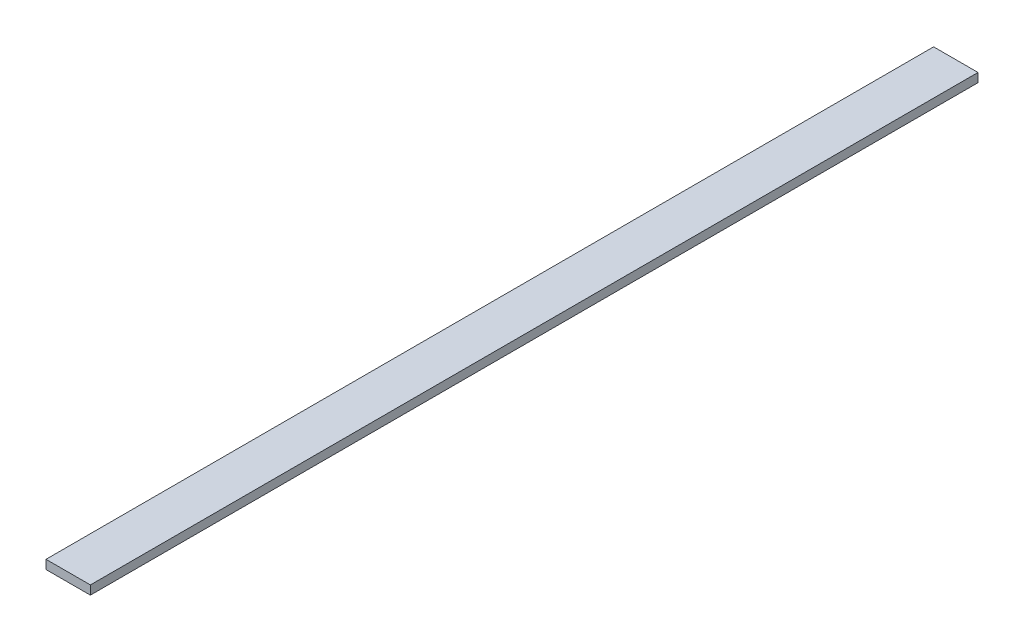
ISO-10303-21;
HEADER;
FILE_DESCRIPTION(('STEP AP214'),'2;1');
FILE_NAME('part.step','',(''),(''),'','','');
FILE_SCHEMA(('AUTOMOTIVE_DESIGN { 1 0 10303 214 1 1 1 1 }'));
ENDSEC;
DATA;
#1=APPLICATION_CONTEXT('core data for automotive mechanical design processes');
#2=APPLICATION_PROTOCOL_DEFINITION('international standard','automotive_design',2000,#1);
#3=PRODUCT_CONTEXT('',#1,'mechanical');
#4=PRODUCT('Part','Part','',(#3));
#5=PRODUCT_RELATED_PRODUCT_CATEGORY('part','',(#4));
#6=PRODUCT_DEFINITION_FORMATION('','',#4);
#7=PRODUCT_DEFINITION_CONTEXT('part definition',#1,'design');
#8=PRODUCT_DEFINITION('design','',#6,#7);
#9=PRODUCT_DEFINITION_SHAPE('','',#8);
#10=(LENGTH_UNIT() NAMED_UNIT(*) SI_UNIT(.MILLI.,.METRE.));
#11=(NAMED_UNIT(*) PLANE_ANGLE_UNIT() SI_UNIT($,.RADIAN.));
#12=(NAMED_UNIT(*) SI_UNIT($,.STERADIAN.) SOLID_ANGLE_UNIT());
#13=UNCERTAINTY_MEASURE_WITH_UNIT(LENGTH_MEASURE(1.E-05),#10,'distance_accuracy_value','');
#14=(GEOMETRIC_REPRESENTATION_CONTEXT(3) GLOBAL_UNCERTAINTY_ASSIGNED_CONTEXT((#13)) GLOBAL_UNIT_ASSIGNED_CONTEXT((#10,
#11,#12)) REPRESENTATION_CONTEXT('',''));
#15=CARTESIAN_POINT('',(0.,0.,0.));
#16=DIRECTION('',(0.,0.,1.));
#17=DIRECTION('',(1.,0.,0.));
#18=AXIS2_PLACEMENT_3D('',#15,#16,#17);
#19=CARTESIAN_POINT('',(0.,2.,0.));
#20=DIRECTION('',(1.,0.,0.));
#21=DIRECTION('',(0.,0.,-1.));
#22=AXIS2_PLACEMENT_3D('',#19,#20,#21);
#23=PLANE('',#22);
#24=DIRECTION('',(0.,0.,1.));
#25=VECTOR('',#24,1.);
#26=CARTESIAN_POINT('',(0.,0.,0.));
#27=LINE('',#26,#25);
#28=CARTESIAN_POINT('',(0.,0.,-200.));
#29=VERTEX_POINT('',#28);
#30=CARTESIAN_POINT('',(0.,0.,0.));
#31=VERTEX_POINT('',#30);
#32=EDGE_CURVE('E107',#29,#31,#27,.T.);
#33=ORIENTED_EDGE('',*,*,#32,.T.);
#34=DIRECTION('',(0.,-1.,0.));
#35=VECTOR('',#34,1.);
#36=CARTESIAN_POINT('',(0.,2.,0.));
#37=LINE('',#36,#35);
#38=CARTESIAN_POINT('',(0.,2.,0.));
#39=VERTEX_POINT('',#38);
#40=EDGE_CURVE('E11',#39,#31,#37,.T.);
#41=ORIENTED_EDGE('',*,*,#40,.F.);
#42=DIRECTION('',(0.,0.,1.));
#43=VECTOR('',#42,1.);
#44=CARTESIAN_POINT('',(0.,2.,0.));
#45=LINE('',#44,#43);
#46=CARTESIAN_POINT('',(0.,2.,-200.));
#47=VERTEX_POINT('',#46);
#48=EDGE_CURVE('E91',#47,#39,#45,.T.);
#49=ORIENTED_EDGE('',*,*,#48,.F.);
#50=DIRECTION('',(0.,-1.,0.));
#51=VECTOR('',#50,1.);
#52=CARTESIAN_POINT('',(0.,2.,-200.));
#53=LINE('',#52,#51);
#54=EDGE_CURVE('E103',#47,#29,#53,.T.);
#55=ORIENTED_EDGE('',*,*,#54,.T.);
#56=EDGE_LOOP('',(#33,#41,#49,#55));
#57=FACE_BOUND('',#56,.T.);
#58=ADVANCED_FACE('F39',(#57),#23,.F.);
#59=CARTESIAN_POINT('',(0.,2.,0.));
#60=DIRECTION('',(0.,0.,-1.));
#61=DIRECTION('',(-1.,0.,0.));
#62=AXIS2_PLACEMENT_3D('',#59,#60,#61);
#63=PLANE('',#62);
#64=DIRECTION('',(1.,0.,0.));
#65=VECTOR('',#64,1.);
#66=CARTESIAN_POINT('',(0.,0.,0.));
#67=LINE('',#66,#65);
#68=CARTESIAN_POINT('',(10.,0.,0.));
#69=VERTEX_POINT('',#68);
#70=EDGE_CURVE('E96',#31,#69,#67,.T.);
#71=ORIENTED_EDGE('',*,*,#70,.T.);
#72=DIRECTION('',(0.,-1.,0.));
#73=VECTOR('',#72,1.);
#74=CARTESIAN_POINT('',(10.,2.,0.));
#75=LINE('',#74,#73);
#76=CARTESIAN_POINT('',(10.,2.,0.));
#77=VERTEX_POINT('',#76);
#78=EDGE_CURVE('E48',#77,#69,#75,.T.);
#79=ORIENTED_EDGE('',*,*,#78,.F.);
#80=DIRECTION('',(1.,0.,0.));
#81=VECTOR('',#80,1.);
#82=CARTESIAN_POINT('',(0.,2.,0.));
#83=LINE('',#82,#81);
#84=EDGE_CURVE('E86',#39,#77,#83,.T.);
#85=ORIENTED_EDGE('',*,*,#84,.F.);
#86=ORIENTED_EDGE('',*,*,#40,.T.);
#87=EDGE_LOOP('',(#71,#79,#85,#86));
#88=FACE_BOUND('',#87,.T.);
#89=ADVANCED_FACE('F95',(#88),#63,.F.);
#90=CARTESIAN_POINT('',(10.,2.,0.));
#91=DIRECTION('',(-1.,0.,0.));
#92=DIRECTION('',(0.,0.,1.));
#93=AXIS2_PLACEMENT_3D('',#90,#91,#92);
#94=PLANE('',#93);
#95=DIRECTION('',(0.,0.,-1.));
#96=VECTOR('',#95,1.);
#97=CARTESIAN_POINT('',(10.,0.,0.));
#98=LINE('',#97,#96);
#99=CARTESIAN_POINT('',(10.,0.,-200.));
#100=VERTEX_POINT('',#99);
#101=EDGE_CURVE('E73',#69,#100,#98,.T.);
#102=ORIENTED_EDGE('',*,*,#101,.T.);
#103=DIRECTION('',(0.,-1.,0.));
#104=VECTOR('',#103,1.);
#105=CARTESIAN_POINT('',(10.,2.,-200.));
#106=LINE('',#105,#104);
#107=CARTESIAN_POINT('',(10.,2.,-200.));
#108=VERTEX_POINT('',#107);
#109=EDGE_CURVE('E98',#108,#100,#106,.T.);
#110=ORIENTED_EDGE('',*,*,#109,.F.);
#111=DIRECTION('',(0.,0.,-1.));
#112=VECTOR('',#111,1.);
#113=CARTESIAN_POINT('',(10.,2.,0.));
#114=LINE('',#113,#112);
#115=EDGE_CURVE('E89',#77,#108,#114,.T.);
#116=ORIENTED_EDGE('',*,*,#115,.F.);
#117=ORIENTED_EDGE('',*,*,#78,.T.);
#118=EDGE_LOOP('',(#102,#110,#116,#117));
#119=FACE_BOUND('',#118,.T.);
#120=ADVANCED_FACE('F99',(#119),#94,.F.);
#121=CARTESIAN_POINT('',(0.,2.,-200.));
#122=DIRECTION('',(0.,0.,1.));
#123=DIRECTION('',(1.,0.,0.));
#124=AXIS2_PLACEMENT_3D('',#121,#122,#123);
#125=PLANE('',#124);
#126=DIRECTION('',(-1.,0.,0.));
#127=VECTOR('',#126,1.);
#128=CARTESIAN_POINT('',(0.,0.,-200.));
#129=LINE('',#128,#127);
#130=EDGE_CURVE('E79',#100,#29,#129,.T.);
#131=ORIENTED_EDGE('',*,*,#130,.T.);
#132=ORIENTED_EDGE('',*,*,#54,.F.);
#133=DIRECTION('',(-1.,0.,0.));
#134=VECTOR('',#133,1.);
#135=CARTESIAN_POINT('',(0.,2.,-200.));
#136=LINE('',#135,#134);
#137=EDGE_CURVE('E56',#108,#47,#136,.T.);
#138=ORIENTED_EDGE('',*,*,#137,.F.);
#139=ORIENTED_EDGE('',*,*,#109,.T.);
#140=EDGE_LOOP('',(#131,#132,#138,#139));
#141=FACE_BOUND('',#140,.T.);
#142=ADVANCED_FACE('F120',(#141),#125,.F.);
#143=CARTESIAN_POINT('',(0.,2.,0.));
#144=DIRECTION('',(0.,-1.,0.));
#145=DIRECTION('',(0.,0.,-1.));
#146=AXIS2_PLACEMENT_3D('',#143,#144,#145);
#147=PLANE('',#146);
#148=ORIENTED_EDGE('',*,*,#48,.T.);
#149=ORIENTED_EDGE('',*,*,#84,.T.);
#150=ORIENTED_EDGE('',*,*,#115,.T.);
#151=ORIENTED_EDGE('',*,*,#137,.T.);
#152=EDGE_LOOP('',(#148,#149,#150,#151));
#153=FACE_BOUND('',#152,.T.);
#154=ADVANCED_FACE('F87',(#153),#147,.F.);
#155=CARTESIAN_POINT('',(0.,0.,0.));
#156=DIRECTION('',(0.,-1.,0.));
#157=DIRECTION('',(0.,0.,-1.));
#158=AXIS2_PLACEMENT_3D('',#155,#156,#157);
#159=PLANE('',#158);
#160=ORIENTED_EDGE('',*,*,#32,.F.);
#161=ORIENTED_EDGE('',*,*,#130,.F.);
#162=ORIENTED_EDGE('',*,*,#101,.F.);
#163=ORIENTED_EDGE('',*,*,#70,.F.);
#164=EDGE_LOOP('',(#160,#161,#162,#163));
#165=FACE_BOUND('',#164,.T.);
#166=ADVANCED_FACE('F123',(#165),#159,.T.);
#167=CLOSED_SHELL('',(#58,#89,#120,#142,#154,#166));
#168=MANIFOLD_SOLID_BREP('B2',#167);
#169=ADVANCED_BREP_SHAPE_REPRESENTATION('',(#18,#168),#14);
#170=SHAPE_DEFINITION_REPRESENTATION(#9,#169);
ENDSEC;
END-ISO-10303-21;
